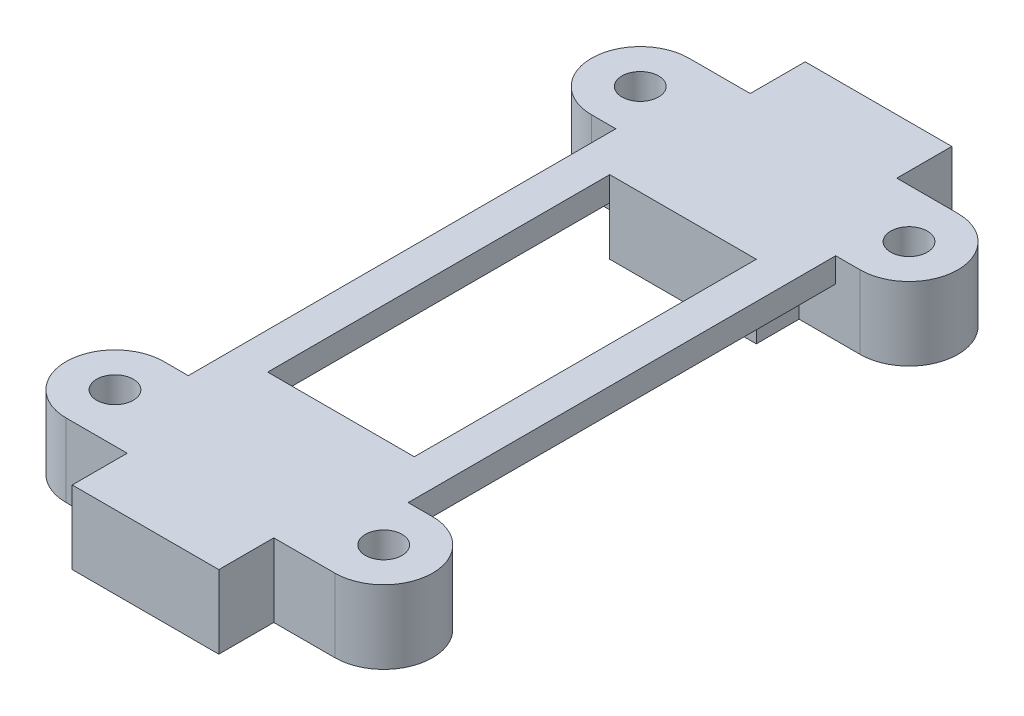
ISO-10303-21;
HEADER;
FILE_DESCRIPTION(('STEP AP214'),'2;1');
FILE_NAME('part.step','',(''),(''),'','','');
FILE_SCHEMA(('AUTOMOTIVE_DESIGN { 1 0 10303 214 1 1 1 1 }'));
ENDSEC;
DATA;
#1=APPLICATION_CONTEXT('core data for automotive mechanical design processes');
#2=APPLICATION_PROTOCOL_DEFINITION('international standard','automotive_design',2000,#1);
#3=PRODUCT_CONTEXT('',#1,'mechanical');
#4=PRODUCT('Part','Part','',(#3));
#5=PRODUCT_RELATED_PRODUCT_CATEGORY('part','',(#4));
#6=PRODUCT_DEFINITION_FORMATION('','',#4);
#7=PRODUCT_DEFINITION_CONTEXT('part definition',#1,'design');
#8=PRODUCT_DEFINITION('design','',#6,#7);
#9=PRODUCT_DEFINITION_SHAPE('','',#8);
#10=(LENGTH_UNIT() NAMED_UNIT(*) SI_UNIT(.MILLI.,.METRE.));
#11=(NAMED_UNIT(*) PLANE_ANGLE_UNIT() SI_UNIT($,.RADIAN.));
#12=(NAMED_UNIT(*) SI_UNIT($,.STERADIAN.) SOLID_ANGLE_UNIT());
#13=UNCERTAINTY_MEASURE_WITH_UNIT(LENGTH_MEASURE(1.E-05),#10,'distance_accuracy_value','');
#14=(GEOMETRIC_REPRESENTATION_CONTEXT(3) GLOBAL_UNCERTAINTY_ASSIGNED_CONTEXT((#13)) GLOBAL_UNIT_ASSIGNED_CONTEXT((#10,
#11,#12)) REPRESENTATION_CONTEXT('',''));
#15=CARTESIAN_POINT('',(0.,0.,0.));
#16=DIRECTION('',(0.,0.,1.));
#17=DIRECTION('',(1.,0.,0.));
#18=AXIS2_PLACEMENT_3D('',#15,#16,#17);
#19=CARTESIAN_POINT('',(6.,6.,4.));
#20=DIRECTION('',(1.,0.,0.));
#21=DIRECTION('',(0.,0.,-1.));
#22=AXIS2_PLACEMENT_3D('',#19,#20,#21);
#23=PLANE('',#22);
#24=DIRECTION('',(0.,-1.,0.));
#25=VECTOR('',#24,1.);
#26=CARTESIAN_POINT('',(6.,6.,4.));
#27=LINE('',#26,#25);
#28=CARTESIAN_POINT('',(6.,4.,4.));
#29=VERTEX_POINT('',#28);
#30=CARTESIAN_POINT('',(6.,0.,4.));
#31=VERTEX_POINT('',#30);
#32=EDGE_CURVE('E451',#29,#31,#27,.T.);
#33=ORIENTED_EDGE('',*,*,#32,.F.);
#34=DIRECTION('',(0.,0.,1.));
#35=VECTOR('',#34,1.);
#36=CARTESIAN_POINT('',(6.,4.,4.));
#37=LINE('',#36,#35);
#38=CARTESIAN_POINT('',(6.,4.,7.5));
#39=VERTEX_POINT('',#38);
#40=EDGE_CURVE('E369',#29,#39,#37,.T.);
#41=ORIENTED_EDGE('',*,*,#40,.T.);
#42=DIRECTION('',(0.,-1.,0.));
#43=VECTOR('',#42,1.);
#44=CARTESIAN_POINT('',(6.,6.,7.5));
#45=LINE('',#44,#43);
#46=CARTESIAN_POINT('',(6.,0.,7.5));
#47=VERTEX_POINT('',#46);
#48=EDGE_CURVE('E468',#39,#47,#45,.T.);
#49=ORIENTED_EDGE('',*,*,#48,.T.);
#50=DIRECTION('',(0.,0.,1.));
#51=VECTOR('',#50,1.);
#52=CARTESIAN_POINT('',(6.,0.,4.));
#53=LINE('',#52,#51);
#54=EDGE_CURVE('E469',#31,#47,#53,.T.);
#55=ORIENTED_EDGE('',*,*,#54,.F.);
#56=EDGE_LOOP('',(#33,#41,#49,#55));
#57=FACE_BOUND('',#56,.T.);
#58=ADVANCED_FACE('F157',(#57),#23,.T.);
#59=CARTESIAN_POINT('',(6.00000000000001,6.,39.));
#60=DIRECTION('',(-1.,0.,0.));
#61=DIRECTION('',(0.,0.,1.));
#62=AXIS2_PLACEMENT_3D('',#59,#60,#61);
#63=PLANE('',#62);
#64=CARTESIAN_POINT('',(6.00000000000001,4.,35.5));
#65=VERTEX_POINT('',#64);
#66=CARTESIAN_POINT('',(6.,4.,39.));
#67=VERTEX_POINT('',#66);
#68=EDGE_CURVE('E361',#65,#67,#37,.T.);
#69=ORIENTED_EDGE('',*,*,#68,.T.);
#70=DIRECTION('',(0.,-1.,0.));
#71=VECTOR('',#70,1.);
#72=CARTESIAN_POINT('',(6.00000000000001,6.,39.));
#73=LINE('',#72,#71);
#74=CARTESIAN_POINT('',(6.00000000000001,0.,39.));
#75=VERTEX_POINT('',#74);
#76=EDGE_CURVE('E374',#67,#75,#73,.T.);
#77=ORIENTED_EDGE('',*,*,#76,.T.);
#78=DIRECTION('',(0.,0.,-1.));
#79=VECTOR('',#78,1.);
#80=CARTESIAN_POINT('',(6.00000000000001,0.,39.));
#81=LINE('',#80,#79);
#82=CARTESIAN_POINT('',(6.00000000000001,0.,35.5));
#83=VERTEX_POINT('',#82);
#84=EDGE_CURVE('E627',#75,#83,#81,.T.);
#85=ORIENTED_EDGE('',*,*,#84,.T.);
#86=DIRECTION('',(0.,-1.,0.));
#87=VECTOR('',#86,1.);
#88=CARTESIAN_POINT('',(6.00000000000001,6.,35.5));
#89=LINE('',#88,#87);
#90=EDGE_CURVE('E376',#65,#83,#89,.T.);
#91=ORIENTED_EDGE('',*,*,#90,.F.);
#92=EDGE_LOOP('',(#69,#77,#85,#91));
#93=FACE_BOUND('',#92,.T.);
#94=ADVANCED_FACE('F372',(#93),#63,.F.);
#95=CARTESIAN_POINT('',(-6.,4.,4.));
#96=DIRECTION('',(1.,0.,0.));
#97=DIRECTION('',(0.,0.,-1.));
#98=AXIS2_PLACEMENT_3D('',#95,#96,#97);
#99=PLANE('',#98);
#100=DIRECTION('',(0.,0.,-1.));
#101=VECTOR('',#100,1.);
#102=CARTESIAN_POINT('',(-6.,6.,4.));
#103=LINE('',#102,#101);
#104=CARTESIAN_POINT('',(-6.,6.,35.5));
#105=VERTEX_POINT('',#104);
#106=CARTESIAN_POINT('',(-6.,6.,7.5));
#107=VERTEX_POINT('',#106);
#108=EDGE_CURVE('E440',#105,#107,#103,.T.);
#109=ORIENTED_EDGE('',*,*,#108,.F.);
#110=DIRECTION('',(0.,-1.,0.));
#111=VECTOR('',#110,1.);
#112=CARTESIAN_POINT('',(-5.99999999999999,6.,35.5));
#113=LINE('',#112,#111);
#114=CARTESIAN_POINT('',(-6.,4.,35.5));
#115=VERTEX_POINT('',#114);
#116=EDGE_CURVE('E397',#105,#115,#113,.T.);
#117=ORIENTED_EDGE('',*,*,#116,.T.);
#118=DIRECTION('',(0.,0.,-1.));
#119=VECTOR('',#118,1.);
#120=CARTESIAN_POINT('',(-6.,4.,4.));
#121=LINE('',#120,#119);
#122=CARTESIAN_POINT('',(-6.,4.,7.5));
#123=VERTEX_POINT('',#122);
#124=EDGE_CURVE('E427',#115,#123,#121,.T.);
#125=ORIENTED_EDGE('',*,*,#124,.T.);
#126=DIRECTION('',(0.,-1.,0.));
#127=VECTOR('',#126,1.);
#128=CARTESIAN_POINT('',(-6.,6.,7.5));
#129=LINE('',#128,#127);
#130=EDGE_CURVE('E455',#107,#123,#129,.T.);
#131=ORIENTED_EDGE('',*,*,#130,.F.);
#132=EDGE_LOOP('',(#109,#117,#125,#131));
#133=FACE_BOUND('',#132,.T.);
#134=ADVANCED_FACE('F767',(#133),#99,.T.);
#135=CARTESIAN_POINT('',(0.,6.,4.));
#136=DIRECTION('',(0.,0.,1.));
#137=DIRECTION('',(1.,0.,0.));
#138=AXIS2_PLACEMENT_3D('',#135,#136,#137);
#139=PLANE('',#138);
#140=DIRECTION('',(0.,1.,0.));
#141=VECTOR('',#140,1.);
#142=CARTESIAN_POINT('',(-9.,4.,4.));
#143=LINE('',#142,#141);
#144=CARTESIAN_POINT('',(-9.,4.,4.));
#145=VERTEX_POINT('',#144);
#146=CARTESIAN_POINT('',(-9.,6.,4.));
#147=VERTEX_POINT('',#146);
#148=EDGE_CURVE('E439',#145,#147,#143,.T.);
#149=ORIENTED_EDGE('',*,*,#148,.T.);
#150=DIRECTION('',(-1.,0.,0.));
#151=VECTOR('',#150,1.);
#152=CARTESIAN_POINT('',(0.,6.,4.));
#153=LINE('',#152,#151);
#154=CARTESIAN_POINT('',(-11.,6.,4.));
#155=VERTEX_POINT('',#154);
#156=EDGE_CURVE('E569',#147,#155,#153,.T.);
#157=ORIENTED_EDGE('',*,*,#156,.T.);
#158=DIRECTION('',(0.,-1.,0.));
#159=VECTOR('',#158,1.);
#160=CARTESIAN_POINT('',(-11.,6.,4.));
#161=LINE('',#160,#159);
#162=CARTESIAN_POINT('',(-11.,0.,4.));
#163=VERTEX_POINT('',#162);
#164=EDGE_CURVE('E482',#155,#163,#161,.T.);
#165=ORIENTED_EDGE('',*,*,#164,.T.);
#166=DIRECTION('',(-1.,0.,0.));
#167=VECTOR('',#166,1.);
#168=CARTESIAN_POINT('',(0.,0.,4.));
#169=LINE('',#168,#167);
#170=CARTESIAN_POINT('',(-6.,0.,4.));
#171=VERTEX_POINT('',#170);
#172=EDGE_CURVE('E535',#171,#163,#169,.T.);
#173=ORIENTED_EDGE('',*,*,#172,.F.);
#174=DIRECTION('',(0.,1.,0.));
#175=VECTOR('',#174,1.);
#176=CARTESIAN_POINT('',(-6.,6.,4.));
#177=LINE('',#176,#175);
#178=CARTESIAN_POINT('',(-6.,4.,4.));
#179=VERTEX_POINT('',#178);
#180=EDGE_CURVE('E463',#171,#179,#177,.T.);
#181=ORIENTED_EDGE('',*,*,#180,.T.);
#182=DIRECTION('',(-1.,0.,0.));
#183=VECTOR('',#182,1.);
#184=CARTESIAN_POINT('',(-6.,4.,4.));
#185=LINE('',#184,#183);
#186=EDGE_CURVE('E426',#179,#145,#185,.T.);
#187=ORIENTED_EDGE('',*,*,#186,.T.);
#188=EDGE_LOOP('',(#149,#157,#165,#173,#181,#187));
#189=FACE_BOUND('',#188,.T.);
#190=ADVANCED_FACE('F783',(#189),#139,.T.);
#191=DIRECTION('',(0.,1.,0.));
#192=VECTOR('',#191,1.);
#193=CARTESIAN_POINT('',(9.,4.,4.));
#194=LINE('',#193,#192);
#195=CARTESIAN_POINT('',(9.00000000000001,4.,4.));
#196=VERTEX_POINT('',#195);
#197=CARTESIAN_POINT('',(9.,6.,4.));
#198=VERTEX_POINT('',#197);
#199=EDGE_CURVE('E175',#196,#198,#194,.T.);
#200=ORIENTED_EDGE('',*,*,#199,.F.);
#201=DIRECTION('',(-1.,0.,0.));
#202=VECTOR('',#201,1.);
#203=CARTESIAN_POINT('',(6.,4.,4.));
#204=LINE('',#203,#202);
#205=EDGE_CURVE('E712',#196,#29,#204,.T.);
#206=ORIENTED_EDGE('',*,*,#205,.T.);
#207=ORIENTED_EDGE('',*,*,#32,.T.);
#208=CARTESIAN_POINT('',(11.,0.,4.));
#209=VERTEX_POINT('',#208);
#210=EDGE_CURVE('E531',#209,#31,#169,.T.);
#211=ORIENTED_EDGE('',*,*,#210,.F.);
#212=DIRECTION('',(0.,-1.,0.));
#213=VECTOR('',#212,1.);
#214=CARTESIAN_POINT('',(11.,6.,4.));
#215=LINE('',#214,#213);
#216=CARTESIAN_POINT('',(11.,6.,4.));
#217=VERTEX_POINT('',#216);
#218=EDGE_CURVE('E486',#217,#209,#215,.T.);
#219=ORIENTED_EDGE('',*,*,#218,.F.);
#220=EDGE_CURVE('E180',#217,#198,#153,.T.);
#221=ORIENTED_EDGE('',*,*,#220,.T.);
#222=EDGE_LOOP('',(#200,#206,#207,#211,#219,#221));
#223=FACE_BOUND('',#222,.T.);
#224=ADVANCED_FACE('F733',(#223),#139,.T.);
#225=CARTESIAN_POINT('',(11.,6.,0.));
#226=DIRECTION('',(0.,-1.,0.));
#227=DIRECTION('',(0.,0.,-1.));
#228=AXIS2_PLACEMENT_3D('',#225,#226,#227);
#229=CYLINDRICAL_SURFACE('',#228,4.);
#230=CARTESIAN_POINT('',(11.,0.,0.));
#231=DIRECTION('',(0.,1.,0.));
#232=DIRECTION('',(0.,0.,1.));
#233=AXIS2_PLACEMENT_3D('',#230,#231,#232);
#234=CIRCLE('',#233,4.);
#235=CARTESIAN_POINT('',(11.,0.,-4.));
#236=VERTEX_POINT('',#235);
#237=EDGE_CURVE('E527',#236,#209,#234,.F.);
#238=ORIENTED_EDGE('',*,*,#237,.F.);
#239=DIRECTION('',(0.,-1.,0.));
#240=VECTOR('',#239,1.);
#241=CARTESIAN_POINT('',(11.,6.,-4.));
#242=LINE('',#241,#240);
#243=CARTESIAN_POINT('',(11.,6.,-4.));
#244=VERTEX_POINT('',#243);
#245=EDGE_CURVE('E489',#244,#236,#242,.T.);
#246=ORIENTED_EDGE('',*,*,#245,.F.);
#247=CARTESIAN_POINT('',(11.,6.,0.));
#248=DIRECTION('',(0.,1.,0.));
#249=DIRECTION('',(0.,0.,1.));
#250=AXIS2_PLACEMENT_3D('',#247,#248,#249);
#251=CIRCLE('',#250,4.);
#252=EDGE_CURVE('E563',#244,#217,#251,.F.);
#253=ORIENTED_EDGE('',*,*,#252,.T.);
#254=ORIENTED_EDGE('',*,*,#218,.T.);
#255=EDGE_LOOP('',(#238,#246,#253,#254));
#256=FACE_BOUND('',#255,.T.);
#257=ADVANCED_FACE('F741',(#256),#229,.T.);
#258=CARTESIAN_POINT('',(0.,6.,-4.));
#259=DIRECTION('',(0.,0.,1.));
#260=DIRECTION('',(1.,0.,0.));
#261=AXIS2_PLACEMENT_3D('',#258,#259,#260);
#262=PLANE('',#261);
#263=DIRECTION('',(-1.,0.,0.));
#264=VECTOR('',#263,1.);
#265=CARTESIAN_POINT('',(0.,0.,-4.));
#266=LINE('',#265,#264);
#267=CARTESIAN_POINT('',(6.,0.,-4.));
#268=VERTEX_POINT('',#267);
#269=EDGE_CURVE('E523',#236,#268,#266,.T.);
#270=ORIENTED_EDGE('',*,*,#269,.T.);
#271=DIRECTION('',(0.,-1.,0.));
#272=VECTOR('',#271,1.);
#273=CARTESIAN_POINT('',(6.,6.,-4.));
#274=LINE('',#273,#272);
#275=CARTESIAN_POINT('',(6.,6.,-4.));
#276=VERTEX_POINT('',#275);
#277=EDGE_CURVE('E492',#276,#268,#274,.T.);
#278=ORIENTED_EDGE('',*,*,#277,.F.);
#279=DIRECTION('',(-1.,0.,0.));
#280=VECTOR('',#279,1.);
#281=CARTESIAN_POINT('',(0.,6.,-4.));
#282=LINE('',#281,#280);
#283=EDGE_CURVE('E559',#244,#276,#282,.T.);
#284=ORIENTED_EDGE('',*,*,#283,.F.);
#285=ORIENTED_EDGE('',*,*,#245,.T.);
#286=EDGE_LOOP('',(#270,#278,#284,#285));
#287=FACE_BOUND('',#286,.T.);
#288=ADVANCED_FACE('F745',(#287),#262,.F.);
#289=CARTESIAN_POINT('',(6.,6.,0.));
#290=DIRECTION('',(-1.,0.,0.));
#291=DIRECTION('',(0.,0.,1.));
#292=AXIS2_PLACEMENT_3D('',#289,#290,#291);
#293=PLANE('',#292);
#294=DIRECTION('',(0.,0.,-1.));
#295=VECTOR('',#294,1.);
#296=CARTESIAN_POINT('',(6.,0.,0.));
#297=LINE('',#296,#295);
#298=CARTESIAN_POINT('',(6.,0.,-8.5));
#299=VERTEX_POINT('',#298);
#300=EDGE_CURVE('E519',#268,#299,#297,.T.);
#301=ORIENTED_EDGE('',*,*,#300,.T.);
#302=DIRECTION('',(0.,-1.,0.));
#303=VECTOR('',#302,1.);
#304=CARTESIAN_POINT('',(6.,6.,-8.5));
#305=LINE('',#304,#303);
#306=CARTESIAN_POINT('',(6.,6.,-8.5));
#307=VERTEX_POINT('',#306);
#308=EDGE_CURVE('E496',#307,#299,#305,.T.);
#309=ORIENTED_EDGE('',*,*,#308,.F.);
#310=DIRECTION('',(0.,0.,-1.));
#311=VECTOR('',#310,1.);
#312=CARTESIAN_POINT('',(6.,6.,0.));
#313=LINE('',#312,#311);
#314=EDGE_CURVE('E555',#276,#307,#313,.T.);
#315=ORIENTED_EDGE('',*,*,#314,.F.);
#316=ORIENTED_EDGE('',*,*,#277,.T.);
#317=EDGE_LOOP('',(#301,#309,#315,#316));
#318=FACE_BOUND('',#317,.T.);
#319=ADVANCED_FACE('F749',(#318),#293,.F.);
#320=CARTESIAN_POINT('',(0.,6.,-8.5));
#321=DIRECTION('',(0.,0.,1.));
#322=DIRECTION('',(1.,0.,0.));
#323=AXIS2_PLACEMENT_3D('',#320,#321,#322);
#324=PLANE('',#323);
#325=DIRECTION('',(-1.,0.,0.));
#326=VECTOR('',#325,1.);
#327=CARTESIAN_POINT('',(0.,0.,-8.5));
#328=LINE('',#327,#326);
#329=CARTESIAN_POINT('',(-6.,0.,-8.5));
#330=VERTEX_POINT('',#329);
#331=EDGE_CURVE('E514',#299,#330,#328,.T.);
#332=ORIENTED_EDGE('',*,*,#331,.T.);
#333=DIRECTION('',(0.,-1.,0.));
#334=VECTOR('',#333,1.);
#335=CARTESIAN_POINT('',(-6.,6.,-8.5));
#336=LINE('',#335,#334);
#337=CARTESIAN_POINT('',(-6.,6.,-8.5));
#338=VERTEX_POINT('',#337);
#339=EDGE_CURVE('E500',#338,#330,#336,.T.);
#340=ORIENTED_EDGE('',*,*,#339,.F.);
#341=DIRECTION('',(-1.,0.,0.));
#342=VECTOR('',#341,1.);
#343=CARTESIAN_POINT('',(0.,6.,-8.5));
#344=LINE('',#343,#342);
#345=EDGE_CURVE('E552',#307,#338,#344,.T.);
#346=ORIENTED_EDGE('',*,*,#345,.F.);
#347=ORIENTED_EDGE('',*,*,#308,.T.);
#348=EDGE_LOOP('',(#332,#340,#346,#347));
#349=FACE_BOUND('',#348,.T.);
#350=ADVANCED_FACE('F751',(#349),#324,.F.);
#351=CARTESIAN_POINT('',(-6.,6.,0.));
#352=DIRECTION('',(-1.,0.,0.));
#353=DIRECTION('',(0.,0.,1.));
#354=AXIS2_PLACEMENT_3D('',#351,#352,#353);
#355=PLANE('',#354);
#356=DIRECTION('',(0.,0.,-1.));
#357=VECTOR('',#356,1.);
#358=CARTESIAN_POINT('',(-6.,0.,0.));
#359=LINE('',#358,#357);
#360=CARTESIAN_POINT('',(-6.,0.,-4.));
#361=VERTEX_POINT('',#360);
#362=EDGE_CURVE('E510',#361,#330,#359,.T.);
#363=ORIENTED_EDGE('',*,*,#362,.F.);
#364=DIRECTION('',(0.,-1.,0.));
#365=VECTOR('',#364,1.);
#366=CARTESIAN_POINT('',(-6.,6.,-4.));
#367=LINE('',#366,#365);
#368=CARTESIAN_POINT('',(-6.,6.,-4.));
#369=VERTEX_POINT('',#368);
#370=EDGE_CURVE('E503',#369,#361,#367,.T.);
#371=ORIENTED_EDGE('',*,*,#370,.F.);
#372=DIRECTION('',(0.,0.,-1.));
#373=VECTOR('',#372,1.);
#374=CARTESIAN_POINT('',(-6.,6.,0.));
#375=LINE('',#374,#373);
#376=EDGE_CURVE('E548',#369,#338,#375,.T.);
#377=ORIENTED_EDGE('',*,*,#376,.T.);
#378=ORIENTED_EDGE('',*,*,#339,.T.);
#379=EDGE_LOOP('',(#363,#371,#377,#378));
#380=FACE_BOUND('',#379,.T.);
#381=ADVANCED_FACE('F753',(#380),#355,.T.);
#382=CARTESIAN_POINT('',(-11.,0.,-4.));
#383=VERTEX_POINT('',#382);
#384=EDGE_CURVE('E515',#361,#383,#266,.T.);
#385=ORIENTED_EDGE('',*,*,#384,.T.);
#386=DIRECTION('',(0.,-1.,0.));
#387=VECTOR('',#386,1.);
#388=CARTESIAN_POINT('',(-11.,6.,-4.));
#389=LINE('',#388,#387);
#390=CARTESIAN_POINT('',(-11.,6.,-4.));
#391=VERTEX_POINT('',#390);
#392=EDGE_CURVE('E506',#391,#383,#389,.T.);
#393=ORIENTED_EDGE('',*,*,#392,.F.);
#394=EDGE_CURVE('E509',#369,#391,#282,.T.);
#395=ORIENTED_EDGE('',*,*,#394,.F.);
#396=ORIENTED_EDGE('',*,*,#370,.T.);
#397=EDGE_LOOP('',(#385,#393,#395,#396));
#398=FACE_BOUND('',#397,.T.);
#399=ADVANCED_FACE('F587',(#398),#262,.F.);
#400=CARTESIAN_POINT('',(-11.,6.,0.));
#401=DIRECTION('',(0.,-1.,0.));
#402=DIRECTION('',(0.,0.,-1.));
#403=AXIS2_PLACEMENT_3D('',#400,#401,#402);
#404=CYLINDRICAL_SURFACE('',#403,4.);
#405=CARTESIAN_POINT('',(-11.,0.,0.));
#406=DIRECTION('',(0.,1.,0.));
#407=DIRECTION('',(0.,0.,1.));
#408=AXIS2_PLACEMENT_3D('',#405,#406,#407);
#409=CIRCLE('',#408,4.);
#410=EDGE_CURVE('E536',#163,#383,#409,.F.);
#411=ORIENTED_EDGE('',*,*,#410,.F.);
#412=ORIENTED_EDGE('',*,*,#164,.F.);
#413=CARTESIAN_POINT('',(-11.,6.,0.));
#414=DIRECTION('',(0.,1.,0.));
#415=DIRECTION('',(0.,0.,1.));
#416=AXIS2_PLACEMENT_3D('',#413,#414,#415);
#417=CIRCLE('',#416,4.);
#418=EDGE_CURVE('E570',#155,#391,#417,.F.);
#419=ORIENTED_EDGE('',*,*,#418,.T.);
#420=ORIENTED_EDGE('',*,*,#392,.T.);
#421=EDGE_LOOP('',(#411,#412,#419,#420));
#422=FACE_BOUND('',#421,.T.);
#423=ADVANCED_FACE('F597',(#422),#404,.T.);
#424=CARTESIAN_POINT('',(11.,6.,0.));
#425=DIRECTION('',(0.,-1.,0.));
#426=DIRECTION('',(0.,0.,-1.));
#427=AXIS2_PLACEMENT_3D('',#424,#425,#426);
#428=CYLINDRICAL_SURFACE('',#427,1.5);
#429=CARTESIAN_POINT('',(11.,6.,0.));
#430=DIRECTION('',(0.,1.,0.));
#431=DIRECTION('',(0.,0.,1.));
#432=AXIS2_PLACEMENT_3D('',#429,#430,#431);
#433=CIRCLE('',#432,1.5);
#434=CARTESIAN_POINT('',(11.,6.,1.5));
#435=VERTEX_POINT('',#434);
#436=EDGE_CURVE('E573',#435,#435,#433,.T.);
#437=ORIENTED_EDGE('',*,*,#436,.T.);
#438=EDGE_LOOP('',(#437));
#439=FACE_BOUND('',#438,.T.);
#440=CARTESIAN_POINT('',(11.,0.,0.));
#441=DIRECTION('',(0.,1.,0.));
#442=DIRECTION('',(0.,0.,1.));
#443=AXIS2_PLACEMENT_3D('',#440,#441,#442);
#444=CIRCLE('',#443,1.5);
#445=CARTESIAN_POINT('',(11.,0.,1.5));
#446=VERTEX_POINT('',#445);
#447=EDGE_CURVE('E540',#446,#446,#444,.T.);
#448=ORIENTED_EDGE('',*,*,#447,.F.);
#449=EDGE_LOOP('',(#448));
#450=FACE_BOUND('',#449,.T.);
#451=ADVANCED_FACE('F776',(#439,#450),#428,.F.);
#452=CARTESIAN_POINT('',(-11.,6.,0.));
#453=DIRECTION('',(0.,-1.,0.));
#454=DIRECTION('',(0.,0.,-1.));
#455=AXIS2_PLACEMENT_3D('',#452,#453,#454);
#456=CYLINDRICAL_SURFACE('',#455,1.5);
#457=CARTESIAN_POINT('',(-11.,6.,0.));
#458=DIRECTION('',(0.,1.,0.));
#459=DIRECTION('',(0.,0.,1.));
#460=AXIS2_PLACEMENT_3D('',#457,#458,#459);
#461=CIRCLE('',#460,1.5);
#462=CARTESIAN_POINT('',(-11.,6.,1.5));
#463=VERTEX_POINT('',#462);
#464=EDGE_CURVE('E161',#463,#463,#461,.T.);
#465=ORIENTED_EDGE('',*,*,#464,.T.);
#466=EDGE_LOOP('',(#465));
#467=FACE_BOUND('',#466,.T.);
#468=CARTESIAN_POINT('',(-11.,0.,0.));
#469=DIRECTION('',(0.,1.,0.));
#470=DIRECTION('',(0.,0.,1.));
#471=AXIS2_PLACEMENT_3D('',#468,#469,#470);
#472=CIRCLE('',#471,1.5);
#473=CARTESIAN_POINT('',(-11.,0.,1.5));
#474=VERTEX_POINT('',#473);
#475=EDGE_CURVE('E544',#474,#474,#472,.T.);
#476=ORIENTED_EDGE('',*,*,#475,.F.);
#477=EDGE_LOOP('',(#476));
#478=FACE_BOUND('',#477,.T.);
#479=ADVANCED_FACE('F773',(#467,#478),#456,.F.);
#480=CARTESIAN_POINT('',(0.,0.,0.));
#481=DIRECTION('',(0.,1.,0.));
#482=DIRECTION('',(0.,0.,1.));
#483=AXIS2_PLACEMENT_3D('',#480,#481,#482);
#484=PLANE('',#483);
#485=ORIENTED_EDGE('',*,*,#475,.T.);
#486=EDGE_LOOP('',(#485));
#487=FACE_BOUND('',#486,.T.);
#488=ORIENTED_EDGE('',*,*,#447,.T.);
#489=EDGE_LOOP('',(#488));
#490=FACE_BOUND('',#489,.T.);
#491=ORIENTED_EDGE('',*,*,#410,.T.);
#492=ORIENTED_EDGE('',*,*,#384,.F.);
#493=ORIENTED_EDGE('',*,*,#362,.T.);
#494=ORIENTED_EDGE('',*,*,#331,.F.);
#495=ORIENTED_EDGE('',*,*,#300,.F.);
#496=ORIENTED_EDGE('',*,*,#269,.F.);
#497=ORIENTED_EDGE('',*,*,#237,.T.);
#498=ORIENTED_EDGE('',*,*,#210,.T.);
#499=ORIENTED_EDGE('',*,*,#54,.T.);
#500=DIRECTION('',(-1.,0.,0.));
#501=VECTOR('',#500,1.);
#502=CARTESIAN_POINT('',(6.,0.,7.5));
#503=LINE('',#502,#501);
#504=CARTESIAN_POINT('',(-6.,0.,7.5));
#505=VERTEX_POINT('',#504);
#506=EDGE_CURVE('E12',#47,#505,#503,.T.);
#507=ORIENTED_EDGE('',*,*,#506,.T.);
#508=DIRECTION('',(0.,0.,1.));
#509=VECTOR('',#508,1.);
#510=CARTESIAN_POINT('',(-6.,0.,4.));
#511=LINE('',#510,#509);
#512=EDGE_CURVE('E167',#171,#505,#511,.T.);
#513=ORIENTED_EDGE('',*,*,#512,.F.);
#514=ORIENTED_EDGE('',*,*,#172,.T.);
#515=EDGE_LOOP('',(#491,#492,#493,#494,#495,#496,#497,#498,#499,#507,#513,#514));
#516=FACE_BOUND('',#515,.T.);
#517=ADVANCED_FACE('F592',(#487,#490,#516),#484,.F.);
#518=CARTESIAN_POINT('',(0.,6.,0.));
#519=DIRECTION('',(0.,1.,0.));
#520=DIRECTION('',(0.,0.,1.));
#521=AXIS2_PLACEMENT_3D('',#518,#519,#520);
#522=PLANE('',#521);
#523=DIRECTION('',(-1.,0.,0.));
#524=VECTOR('',#523,1.);
#525=CARTESIAN_POINT('',(6.,6.,7.5));
#526=LINE('',#525,#524);
#527=CARTESIAN_POINT('',(6.,6.,7.5));
#528=VERTEX_POINT('',#527);
#529=EDGE_CURVE('E459',#528,#107,#526,.T.);
#530=ORIENTED_EDGE('',*,*,#529,.F.);
#531=DIRECTION('',(0.,0.,1.));
#532=VECTOR('',#531,1.);
#533=CARTESIAN_POINT('',(6.,6.,4.));
#534=LINE('',#533,#532);
#535=CARTESIAN_POINT('',(6.,6.,35.5));
#536=VERTEX_POINT('',#535);
#537=EDGE_CURVE('E718',#528,#536,#534,.T.);
#538=ORIENTED_EDGE('',*,*,#537,.T.);
#539=DIRECTION('',(-1.,0.,0.));
#540=VECTOR('',#539,1.);
#541=CARTESIAN_POINT('',(6.00000000000001,6.,35.5));
#542=LINE('',#541,#540);
#543=EDGE_CURVE('E670',#536,#105,#542,.T.);
#544=ORIENTED_EDGE('',*,*,#543,.T.);
#545=ORIENTED_EDGE('',*,*,#108,.T.);
#546=EDGE_LOOP('',(#530,#538,#544,#545));
#547=FACE_BOUND('',#546,.T.);
#548=DIRECTION('',(1.,0.,0.));
#549=VECTOR('',#548,1.);
#550=CARTESIAN_POINT('',(6.00000000000001,6.,39.));
#551=LINE('',#550,#549);
#552=CARTESIAN_POINT('',(9.00000000000001,6.,39.));
#553=VERTEX_POINT('',#552);
#554=CARTESIAN_POINT('',(11.,6.,39.));
#555=VERTEX_POINT('',#554);
#556=EDGE_CURVE('E667',#553,#555,#551,.T.);
#557=ORIENTED_EDGE('',*,*,#556,.F.);
#558=DIRECTION('',(0.,0.,-1.));
#559=VECTOR('',#558,1.);
#560=CARTESIAN_POINT('',(9.,6.,4.));
#561=LINE('',#560,#559);
#562=EDGE_CURVE('E380',#553,#198,#561,.T.);
#563=ORIENTED_EDGE('',*,*,#562,.T.);
#564=ORIENTED_EDGE('',*,*,#220,.F.);
#565=ORIENTED_EDGE('',*,*,#252,.F.);
#566=ORIENTED_EDGE('',*,*,#283,.T.);
#567=ORIENTED_EDGE('',*,*,#314,.T.);
#568=ORIENTED_EDGE('',*,*,#345,.T.);
#569=ORIENTED_EDGE('',*,*,#376,.F.);
#570=ORIENTED_EDGE('',*,*,#394,.T.);
#571=ORIENTED_EDGE('',*,*,#418,.F.);
#572=ORIENTED_EDGE('',*,*,#156,.F.);
#573=DIRECTION('',(0.,0.,1.));
#574=VECTOR('',#573,1.);
#575=CARTESIAN_POINT('',(-9.,6.,4.));
#576=LINE('',#575,#574);
#577=CARTESIAN_POINT('',(-9.,6.,39.));
#578=VERTEX_POINT('',#577);
#579=EDGE_CURVE('E443',#147,#578,#576,.T.);
#580=ORIENTED_EDGE('',*,*,#579,.T.);
#581=DIRECTION('',(1.,0.,0.));
#582=VECTOR('',#581,1.);
#583=CARTESIAN_POINT('',(-11.,6.,39.));
#584=LINE('',#583,#582);
#585=CARTESIAN_POINT('',(-11.,6.,39.));
#586=VERTEX_POINT('',#585);
#587=EDGE_CURVE('E674',#586,#578,#584,.T.);
#588=ORIENTED_EDGE('',*,*,#587,.F.);
#589=CARTESIAN_POINT('',(-11.,6.,43.));
#590=DIRECTION('',(0.,1.,0.));
#591=DIRECTION('',(0.,0.,1.));
#592=AXIS2_PLACEMENT_3D('',#589,#590,#591);
#593=CIRCLE('',#592,4.);
#594=CARTESIAN_POINT('',(-11.,6.,47.));
#595=VERTEX_POINT('',#594);
#596=EDGE_CURVE('E678',#586,#595,#593,.T.);
#597=ORIENTED_EDGE('',*,*,#596,.T.);
#598=DIRECTION('',(1.,0.,0.));
#599=VECTOR('',#598,1.);
#600=CARTESIAN_POINT('',(-11.,6.,47.));
#601=LINE('',#600,#599);
#602=CARTESIAN_POINT('',(-5.99999999999999,6.,47.));
#603=VERTEX_POINT('',#602);
#604=EDGE_CURVE('E681',#595,#603,#601,.T.);
#605=ORIENTED_EDGE('',*,*,#604,.T.);
#606=DIRECTION('',(0.,0.,1.));
#607=VECTOR('',#606,1.);
#608=CARTESIAN_POINT('',(-5.99999999999999,6.,47.));
#609=LINE('',#608,#607);
#610=CARTESIAN_POINT('',(-5.99999999999999,6.,51.5));
#611=VERTEX_POINT('',#610);
#612=EDGE_CURVE('E684',#603,#611,#609,.T.);
#613=ORIENTED_EDGE('',*,*,#612,.T.);
#614=DIRECTION('',(-1.,0.,0.));
#615=VECTOR('',#614,1.);
#616=CARTESIAN_POINT('',(6.00000000000001,6.,51.5));
#617=LINE('',#616,#615);
#618=CARTESIAN_POINT('',(6.00000000000001,6.,51.5));
#619=VERTEX_POINT('',#618);
#620=EDGE_CURVE('E687',#619,#611,#617,.T.);
#621=ORIENTED_EDGE('',*,*,#620,.F.);
#622=DIRECTION('',(0.,0.,1.));
#623=VECTOR('',#622,1.);
#624=CARTESIAN_POINT('',(6.00000000000002,6.,47.));
#625=LINE('',#624,#623);
#626=CARTESIAN_POINT('',(6.00000000000002,6.,47.));
#627=VERTEX_POINT('',#626);
#628=EDGE_CURVE('E621',#627,#619,#625,.T.);
#629=ORIENTED_EDGE('',*,*,#628,.F.);
#630=DIRECTION('',(1.,0.,0.));
#631=VECTOR('',#630,1.);
#632=CARTESIAN_POINT('',(6.00000000000002,6.,47.));
#633=LINE('',#632,#631);
#634=CARTESIAN_POINT('',(11.,6.,47.));
#635=VERTEX_POINT('',#634);
#636=EDGE_CURVE('E421',#627,#635,#633,.T.);
#637=ORIENTED_EDGE('',*,*,#636,.T.);
#638=CARTESIAN_POINT('',(11.,6.,43.));
#639=DIRECTION('',(0.,1.,0.));
#640=DIRECTION('',(0.,0.,1.));
#641=AXIS2_PLACEMENT_3D('',#638,#639,#640);
#642=CIRCLE('',#641,4.);
#643=EDGE_CURVE('E663',#635,#555,#642,.T.);
#644=ORIENTED_EDGE('',*,*,#643,.T.);
#645=EDGE_LOOP('',(#557,#563,#564,#565,#566,#567,#568,#569,#570,#571,#572,#580,#588,#597,#605,
#613,#621,#629,#637,#644));
#646=FACE_BOUND('',#645,.T.);
#647=ORIENTED_EDGE('',*,*,#464,.F.);
#648=EDGE_LOOP('',(#647));
#649=FACE_BOUND('',#648,.T.);
#650=ORIENTED_EDGE('',*,*,#436,.F.);
#651=EDGE_LOOP('',(#650));
#652=FACE_BOUND('',#651,.T.);
#653=CARTESIAN_POINT('',(11.,6.,43.));
#654=DIRECTION('',(0.,-1.,0.));
#655=DIRECTION('',(0.,0.,-1.));
#656=AXIS2_PLACEMENT_3D('',#653,#654,#655);
#657=CIRCLE('',#656,1.5);
#658=CARTESIAN_POINT('',(11.,6.,41.5));
#659=VERTEX_POINT('',#658);
#660=EDGE_CURVE('E698',#659,#659,#657,.T.);
#661=ORIENTED_EDGE('',*,*,#660,.T.);
#662=EDGE_LOOP('',(#661));
#663=FACE_BOUND('',#662,.T.);
#664=CARTESIAN_POINT('',(-11.,6.,43.));
#665=DIRECTION('',(0.,-1.,0.));
#666=DIRECTION('',(0.,0.,-1.));
#667=AXIS2_PLACEMENT_3D('',#664,#665,#666);
#668=CIRCLE('',#667,1.5);
#669=CARTESIAN_POINT('',(-11.,6.,41.5));
#670=VERTEX_POINT('',#669);
#671=EDGE_CURVE('E660',#670,#670,#668,.T.);
#672=ORIENTED_EDGE('',*,*,#671,.T.);
#673=EDGE_LOOP('',(#672));
#674=FACE_BOUND('',#673,.T.);
#675=ADVANCED_FACE('F159',(#547,#646,#649,#652,#663,#674),#522,.T.);
#676=CARTESIAN_POINT('',(-6.,6.,4.));
#677=DIRECTION('',(1.,0.,0.));
#678=DIRECTION('',(0.,0.,-1.));
#679=AXIS2_PLACEMENT_3D('',#676,#677,#678);
#680=PLANE('',#679);
#681=EDGE_CURVE('E460',#123,#505,#129,.T.);
#682=ORIENTED_EDGE('',*,*,#681,.F.);
#683=EDGE_CURVE('E428',#123,#179,#121,.T.);
#684=ORIENTED_EDGE('',*,*,#683,.T.);
#685=ORIENTED_EDGE('',*,*,#180,.F.);
#686=ORIENTED_EDGE('',*,*,#512,.T.);
#687=EDGE_LOOP('',(#682,#684,#685,#686));
#688=FACE_BOUND('',#687,.T.);
#689=ADVANCED_FACE('F771',(#688),#680,.F.);
#690=CARTESIAN_POINT('',(6.,6.,7.5));
#691=DIRECTION('',(0.,0.,1.));
#692=DIRECTION('',(1.,0.,0.));
#693=AXIS2_PLACEMENT_3D('',#690,#691,#692);
#694=PLANE('',#693);
#695=ORIENTED_EDGE('',*,*,#506,.F.);
#696=ORIENTED_EDGE('',*,*,#48,.F.);
#697=EDGE_CURVE('E464',#528,#39,#45,.T.);
#698=ORIENTED_EDGE('',*,*,#697,.F.);
#699=ORIENTED_EDGE('',*,*,#529,.T.);
#700=ORIENTED_EDGE('',*,*,#130,.T.);
#701=ORIENTED_EDGE('',*,*,#681,.T.);
#702=EDGE_LOOP('',(#695,#696,#698,#699,#700,#701));
#703=FACE_BOUND('',#702,.T.);
#704=ADVANCED_FACE('F798',(#703),#694,.T.);
#705=CARTESIAN_POINT('',(-9.,4.,4.));
#706=DIRECTION('',(-1.,0.,0.));
#707=DIRECTION('',(0.,0.,1.));
#708=AXIS2_PLACEMENT_3D('',#705,#706,#707);
#709=PLANE('',#708);
#710=ORIENTED_EDGE('',*,*,#579,.F.);
#711=ORIENTED_EDGE('',*,*,#148,.F.);
#712=DIRECTION('',(0.,0.,1.));
#713=VECTOR('',#712,1.);
#714=CARTESIAN_POINT('',(-9.,4.,4.));
#715=LINE('',#714,#713);
#716=CARTESIAN_POINT('',(-9.,4.,39.));
#717=VERTEX_POINT('',#716);
#718=EDGE_CURVE('E432',#145,#717,#715,.T.);
#719=ORIENTED_EDGE('',*,*,#718,.T.);
#720=DIRECTION('',(0.,1.,0.));
#721=VECTOR('',#720,1.);
#722=CARTESIAN_POINT('',(-9.,4.,39.));
#723=LINE('',#722,#721);
#724=EDGE_CURVE('E448',#717,#578,#723,.T.);
#725=ORIENTED_EDGE('',*,*,#724,.T.);
#726=EDGE_LOOP('',(#710,#711,#719,#725));
#727=FACE_BOUND('',#726,.T.);
#728=ADVANCED_FACE('F808',(#727),#709,.T.);
#729=CARTESIAN_POINT('',(0.,4.,0.));
#730=DIRECTION('',(0.,-1.,0.));
#731=DIRECTION('',(0.,0.,-1.));
#732=AXIS2_PLACEMENT_3D('',#729,#730,#731);
#733=PLANE('',#732);
#734=CARTESIAN_POINT('',(-5.99999999999999,4.,39.));
#735=VERTEX_POINT('',#734);
#736=EDGE_CURVE('E422',#735,#115,#121,.T.);
#737=ORIENTED_EDGE('',*,*,#736,.F.);
#738=DIRECTION('',(1.,0.,0.));
#739=VECTOR('',#738,1.);
#740=CARTESIAN_POINT('',(-6.,4.,39.));
#741=LINE('',#740,#739);
#742=EDGE_CURVE('E435',#717,#735,#741,.T.);
#743=ORIENTED_EDGE('',*,*,#742,.F.);
#744=ORIENTED_EDGE('',*,*,#718,.F.);
#745=ORIENTED_EDGE('',*,*,#186,.F.);
#746=ORIENTED_EDGE('',*,*,#683,.F.);
#747=ORIENTED_EDGE('',*,*,#124,.F.);
#748=EDGE_LOOP('',(#737,#743,#744,#745,#746,#747));
#749=FACE_BOUND('',#748,.T.);
#750=ADVANCED_FACE('F815',(#749),#733,.T.);
#751=CARTESIAN_POINT('',(6.00000000000002,6.,47.));
#752=DIRECTION('',(1.,0.,0.));
#753=DIRECTION('',(0.,0.,-1.));
#754=AXIS2_PLACEMENT_3D('',#751,#752,#753);
#755=PLANE('',#754);
#756=DIRECTION('',(0.,0.,1.));
#757=VECTOR('',#756,1.);
#758=CARTESIAN_POINT('',(6.00000000000002,0.,47.));
#759=LINE('',#758,#757);
#760=CARTESIAN_POINT('',(6.00000000000002,0.,47.));
#761=VERTEX_POINT('',#760);
#762=CARTESIAN_POINT('',(6.00000000000001,0.,51.5));
#763=VERTEX_POINT('',#762);
#764=EDGE_CURVE('E656',#761,#763,#759,.T.);
#765=ORIENTED_EDGE('',*,*,#764,.F.);
#766=DIRECTION('',(0.,-1.,0.));
#767=VECTOR('',#766,1.);
#768=CARTESIAN_POINT('',(6.00000000000002,6.,47.));
#769=LINE('',#768,#767);
#770=EDGE_CURVE('E444',#627,#761,#769,.T.);
#771=ORIENTED_EDGE('',*,*,#770,.F.);
#772=ORIENTED_EDGE('',*,*,#628,.T.);
#773=DIRECTION('',(0.,-1.,0.));
#774=VECTOR('',#773,1.);
#775=CARTESIAN_POINT('',(6.00000000000001,6.,51.5));
#776=LINE('',#775,#774);
#777=EDGE_CURVE('E418',#619,#763,#776,.T.);
#778=ORIENTED_EDGE('',*,*,#777,.T.);
#779=EDGE_LOOP('',(#765,#771,#772,#778));
#780=FACE_BOUND('',#779,.T.);
#781=ADVANCED_FACE('F824',(#780),#755,.T.);
#782=CARTESIAN_POINT('',(6.00000000000002,6.,47.));
#783=DIRECTION('',(0.,0.,-1.));
#784=DIRECTION('',(-1.,0.,0.));
#785=AXIS2_PLACEMENT_3D('',#782,#783,#784);
#786=PLANE('',#785);
#787=DIRECTION('',(1.,0.,0.));
#788=VECTOR('',#787,1.);
#789=CARTESIAN_POINT('',(6.00000000000002,0.,47.));
#790=LINE('',#789,#788);
#791=CARTESIAN_POINT('',(11.,0.,47.));
#792=VERTEX_POINT('',#791);
#793=EDGE_CURVE('E618',#761,#792,#790,.T.);
#794=ORIENTED_EDGE('',*,*,#793,.T.);
#795=DIRECTION('',(0.,-1.,0.));
#796=VECTOR('',#795,1.);
#797=CARTESIAN_POINT('',(11.,6.,47.));
#798=LINE('',#797,#796);
#799=EDGE_CURVE('E392',#635,#792,#798,.T.);
#800=ORIENTED_EDGE('',*,*,#799,.F.);
#801=ORIENTED_EDGE('',*,*,#636,.F.);
#802=ORIENTED_EDGE('',*,*,#770,.T.);
#803=EDGE_LOOP('',(#794,#800,#801,#802));
#804=FACE_BOUND('',#803,.T.);
#805=ADVANCED_FACE('F828',(#804),#786,.F.);
#806=CARTESIAN_POINT('',(11.,6.,43.));
#807=DIRECTION('',(0.,-1.,0.));
#808=DIRECTION('',(0.,0.,-1.));
#809=AXIS2_PLACEMENT_3D('',#806,#807,#808);
#810=CYLINDRICAL_SURFACE('',#809,4.);
#811=CARTESIAN_POINT('',(11.,0.,43.));
#812=DIRECTION('',(0.,1.,0.));
#813=DIRECTION('',(0.,0.,1.));
#814=AXIS2_PLACEMENT_3D('',#811,#812,#813);
#815=CIRCLE('',#814,4.);
#816=CARTESIAN_POINT('',(11.,0.,39.));
#817=VERTEX_POINT('',#816);
#818=EDGE_CURVE('E622',#792,#817,#815,.T.);
#819=ORIENTED_EDGE('',*,*,#818,.T.);
#820=DIRECTION('',(0.,-1.,0.));
#821=VECTOR('',#820,1.);
#822=CARTESIAN_POINT('',(11.,6.,39.));
#823=LINE('',#822,#821);
#824=EDGE_CURVE('E387',#555,#817,#823,.T.);
#825=ORIENTED_EDGE('',*,*,#824,.F.);
#826=ORIENTED_EDGE('',*,*,#643,.F.);
#827=ORIENTED_EDGE('',*,*,#799,.T.);
#828=EDGE_LOOP('',(#819,#825,#826,#827));
#829=FACE_BOUND('',#828,.T.);
#830=ADVANCED_FACE('F861',(#829),#810,.T.);
#831=CARTESIAN_POINT('',(6.00000000000001,6.,39.));
#832=DIRECTION('',(0.,0.,-1.));
#833=DIRECTION('',(-1.,0.,0.));
#834=AXIS2_PLACEMENT_3D('',#831,#832,#833);
#835=PLANE('',#834);
#836=DIRECTION('',(0.,1.,0.));
#837=VECTOR('',#836,1.);
#838=CARTESIAN_POINT('',(9.00000000000001,4.,39.));
#839=LINE('',#838,#837);
#840=CARTESIAN_POINT('',(9.00000000000001,4.,39.));
#841=VERTEX_POINT('',#840);
#842=EDGE_CURVE('E709',#841,#553,#839,.T.);
#843=ORIENTED_EDGE('',*,*,#842,.T.);
#844=ORIENTED_EDGE('',*,*,#556,.T.);
#845=ORIENTED_EDGE('',*,*,#824,.T.);
#846=DIRECTION('',(1.,0.,0.));
#847=VECTOR('',#846,1.);
#848=CARTESIAN_POINT('',(6.00000000000001,0.,39.));
#849=LINE('',#848,#847);
#850=EDGE_CURVE('E385',#75,#817,#849,.T.);
#851=ORIENTED_EDGE('',*,*,#850,.F.);
#852=ORIENTED_EDGE('',*,*,#76,.F.);
#853=DIRECTION('',(1.,0.,0.));
#854=VECTOR('',#853,1.);
#855=CARTESIAN_POINT('',(6.,4.,39.));
#856=LINE('',#855,#854);
#857=EDGE_CURVE('E356',#67,#841,#856,.T.);
#858=ORIENTED_EDGE('',*,*,#857,.T.);
#859=EDGE_LOOP('',(#843,#844,#845,#851,#852,#858));
#860=FACE_BOUND('',#859,.T.);
#861=ADVANCED_FACE('F383',(#860),#835,.T.);
#862=CARTESIAN_POINT('',(6.00000000000001,6.,35.5));
#863=DIRECTION('',(0.,0.,1.));
#864=DIRECTION('',(1.,0.,0.));
#865=AXIS2_PLACEMENT_3D('',#862,#863,#864);
#866=PLANE('',#865);
#867=DIRECTION('',(-1.,0.,0.));
#868=VECTOR('',#867,1.);
#869=CARTESIAN_POINT('',(6.00000000000001,0.,35.5));
#870=LINE('',#869,#868);
#871=CARTESIAN_POINT('',(-5.99999999999999,0.,35.5));
#872=VERTEX_POINT('',#871);
#873=EDGE_CURVE('E630',#83,#872,#870,.T.);
#874=ORIENTED_EDGE('',*,*,#873,.T.);
#875=EDGE_CURVE('E400',#115,#872,#113,.T.);
#876=ORIENTED_EDGE('',*,*,#875,.F.);
#877=ORIENTED_EDGE('',*,*,#116,.F.);
#878=ORIENTED_EDGE('',*,*,#543,.F.);
#879=EDGE_CURVE('E388',#536,#65,#89,.T.);
#880=ORIENTED_EDGE('',*,*,#879,.T.);
#881=ORIENTED_EDGE('',*,*,#90,.T.);
#882=EDGE_LOOP('',(#874,#876,#877,#878,#880,#881));
#883=FACE_BOUND('',#882,.T.);
#884=ADVANCED_FACE('F854',(#883),#866,.F.);
#885=CARTESIAN_POINT('',(-5.99999999999999,6.,39.));
#886=DIRECTION('',(-1.,0.,0.));
#887=DIRECTION('',(0.,0.,1.));
#888=AXIS2_PLACEMENT_3D('',#885,#886,#887);
#889=PLANE('',#888);
#890=DIRECTION('',(0.,-1.,0.));
#891=VECTOR('',#890,1.);
#892=CARTESIAN_POINT('',(-5.99999999999999,6.,39.));
#893=LINE('',#892,#891);
#894=CARTESIAN_POINT('',(-5.99999999999999,0.,39.));
#895=VERTEX_POINT('',#894);
#896=EDGE_CURVE('E401',#735,#895,#893,.T.);
#897=ORIENTED_EDGE('',*,*,#896,.F.);
#898=ORIENTED_EDGE('',*,*,#736,.T.);
#899=ORIENTED_EDGE('',*,*,#875,.T.);
#900=DIRECTION('',(0.,0.,-1.));
#901=VECTOR('',#900,1.);
#902=CARTESIAN_POINT('',(-5.99999999999999,0.,39.));
#903=LINE('',#902,#901);
#904=EDGE_CURVE('E634',#895,#872,#903,.T.);
#905=ORIENTED_EDGE('',*,*,#904,.F.);
#906=EDGE_LOOP('',(#897,#898,#899,#905));
#907=FACE_BOUND('',#906,.T.);
#908=ADVANCED_FACE('F850',(#907),#889,.T.);
#909=CARTESIAN_POINT('',(-11.,6.,39.));
#910=DIRECTION('',(0.,0.,-1.));
#911=DIRECTION('',(-1.,0.,0.));
#912=AXIS2_PLACEMENT_3D('',#909,#910,#911);
#913=PLANE('',#912);
#914=ORIENTED_EDGE('',*,*,#587,.T.);
#915=ORIENTED_EDGE('',*,*,#724,.F.);
#916=ORIENTED_EDGE('',*,*,#742,.T.);
#917=ORIENTED_EDGE('',*,*,#896,.T.);
#918=DIRECTION('',(1.,0.,0.));
#919=VECTOR('',#918,1.);
#920=CARTESIAN_POINT('',(-11.,0.,39.));
#921=LINE('',#920,#919);
#922=CARTESIAN_POINT('',(-11.,0.,39.));
#923=VERTEX_POINT('',#922);
#924=EDGE_CURVE('E638',#923,#895,#921,.T.);
#925=ORIENTED_EDGE('',*,*,#924,.F.);
#926=DIRECTION('',(0.,-1.,0.));
#927=VECTOR('',#926,1.);
#928=CARTESIAN_POINT('',(-11.,6.,39.));
#929=LINE('',#928,#927);
#930=EDGE_CURVE('E404',#586,#923,#929,.T.);
#931=ORIENTED_EDGE('',*,*,#930,.F.);
#932=EDGE_LOOP('',(#914,#915,#916,#917,#925,#931));
#933=FACE_BOUND('',#932,.T.);
#934=ADVANCED_FACE('F846',(#933),#913,.T.);
#935=CARTESIAN_POINT('',(-11.,6.,43.));
#936=DIRECTION('',(0.,-1.,0.));
#937=DIRECTION('',(0.,0.,-1.));
#938=AXIS2_PLACEMENT_3D('',#935,#936,#937);
#939=CYLINDRICAL_SURFACE('',#938,4.);
#940=CARTESIAN_POINT('',(-11.,0.,43.));
#941=DIRECTION('',(0.,1.,0.));
#942=DIRECTION('',(0.,0.,1.));
#943=AXIS2_PLACEMENT_3D('',#940,#941,#942);
#944=CIRCLE('',#943,4.);
#945=CARTESIAN_POINT('',(-11.,0.,47.));
#946=VERTEX_POINT('',#945);
#947=EDGE_CURVE('E642',#923,#946,#944,.T.);
#948=ORIENTED_EDGE('',*,*,#947,.T.);
#949=DIRECTION('',(0.,-1.,0.));
#950=VECTOR('',#949,1.);
#951=CARTESIAN_POINT('',(-11.,6.,47.));
#952=LINE('',#951,#950);
#953=EDGE_CURVE('E407',#595,#946,#952,.T.);
#954=ORIENTED_EDGE('',*,*,#953,.F.);
#955=ORIENTED_EDGE('',*,*,#596,.F.);
#956=ORIENTED_EDGE('',*,*,#930,.T.);
#957=EDGE_LOOP('',(#948,#954,#955,#956));
#958=FACE_BOUND('',#957,.T.);
#959=ADVANCED_FACE('F842',(#958),#939,.T.);
#960=CARTESIAN_POINT('',(-11.,6.,47.));
#961=DIRECTION('',(0.,0.,-1.));
#962=DIRECTION('',(-1.,0.,0.));
#963=AXIS2_PLACEMENT_3D('',#960,#961,#962);
#964=PLANE('',#963);
#965=DIRECTION('',(1.,0.,0.));
#966=VECTOR('',#965,1.);
#967=CARTESIAN_POINT('',(-11.,0.,47.));
#968=LINE('',#967,#966);
#969=CARTESIAN_POINT('',(-5.99999999999999,0.,47.));
#970=VERTEX_POINT('',#969);
#971=EDGE_CURVE('E645',#946,#970,#968,.T.);
#972=ORIENTED_EDGE('',*,*,#971,.T.);
#973=DIRECTION('',(0.,-1.,0.));
#974=VECTOR('',#973,1.);
#975=CARTESIAN_POINT('',(-5.99999999999999,6.,47.));
#976=LINE('',#975,#974);
#977=EDGE_CURVE('E411',#603,#970,#976,.T.);
#978=ORIENTED_EDGE('',*,*,#977,.F.);
#979=ORIENTED_EDGE('',*,*,#604,.F.);
#980=ORIENTED_EDGE('',*,*,#953,.T.);
#981=EDGE_LOOP('',(#972,#978,#979,#980));
#982=FACE_BOUND('',#981,.T.);
#983=ADVANCED_FACE('F838',(#982),#964,.F.);
#984=CARTESIAN_POINT('',(-5.99999999999999,6.,47.));
#985=DIRECTION('',(1.,0.,0.));
#986=DIRECTION('',(0.,0.,-1.));
#987=AXIS2_PLACEMENT_3D('',#984,#985,#986);
#988=PLANE('',#987);
#989=DIRECTION('',(0.,0.,1.));
#990=VECTOR('',#989,1.);
#991=CARTESIAN_POINT('',(-5.99999999999999,0.,47.));
#992=LINE('',#991,#990);
#993=CARTESIAN_POINT('',(-5.99999999999999,0.,51.5));
#994=VERTEX_POINT('',#993);
#995=EDGE_CURVE('E648',#970,#994,#992,.T.);
#996=ORIENTED_EDGE('',*,*,#995,.T.);
#997=DIRECTION('',(0.,-1.,0.));
#998=VECTOR('',#997,1.);
#999=CARTESIAN_POINT('',(-5.99999999999999,6.,51.5));
#1000=LINE('',#999,#998);
#1001=EDGE_CURVE('E415',#611,#994,#1000,.T.);
#1002=ORIENTED_EDGE('',*,*,#1001,.F.);
#1003=ORIENTED_EDGE('',*,*,#612,.F.);
#1004=ORIENTED_EDGE('',*,*,#977,.T.);
#1005=EDGE_LOOP('',(#996,#1002,#1003,#1004));
#1006=FACE_BOUND('',#1005,.T.);
#1007=ADVANCED_FACE('F834',(#1006),#988,.F.);
#1008=CARTESIAN_POINT('',(6.00000000000001,6.,51.5));
#1009=DIRECTION('',(0.,0.,1.));
#1010=DIRECTION('',(1.,0.,0.));
#1011=AXIS2_PLACEMENT_3D('',#1008,#1009,#1010);
#1012=PLANE('',#1011);
#1013=DIRECTION('',(-1.,0.,0.));
#1014=VECTOR('',#1013,1.);
#1015=CARTESIAN_POINT('',(6.00000000000001,0.,51.5));
#1016=LINE('',#1015,#1014);
#1017=EDGE_CURVE('E652',#763,#994,#1016,.T.);
#1018=ORIENTED_EDGE('',*,*,#1017,.F.);
#1019=ORIENTED_EDGE('',*,*,#777,.F.);
#1020=ORIENTED_EDGE('',*,*,#620,.T.);
#1021=ORIENTED_EDGE('',*,*,#1001,.T.);
#1022=EDGE_LOOP('',(#1018,#1019,#1020,#1021));
#1023=FACE_BOUND('',#1022,.T.);
#1024=ADVANCED_FACE('F830',(#1023),#1012,.T.);
#1025=CARTESIAN_POINT('',(-11.,0.,43.));
#1026=DIRECTION('',(0.,1.,0.));
#1027=DIRECTION('',(0.,0.,1.));
#1028=AXIS2_PLACEMENT_3D('',#1025,#1026,#1027);
#1029=PLANE('',#1028);
#1030=CARTESIAN_POINT('',(11.,0.,43.));
#1031=DIRECTION('',(0.,-1.,0.));
#1032=DIRECTION('',(0.,0.,-1.));
#1033=AXIS2_PLACEMENT_3D('',#1030,#1031,#1032);
#1034=CIRCLE('',#1033,1.5);
#1035=CARTESIAN_POINT('',(11.,0.,41.5));
#1036=VERTEX_POINT('',#1035);
#1037=EDGE_CURVE('E702',#1036,#1036,#1034,.T.);
#1038=ORIENTED_EDGE('',*,*,#1037,.F.);
#1039=EDGE_LOOP('',(#1038));
#1040=FACE_BOUND('',#1039,.T.);
#1041=CARTESIAN_POINT('',(-11.,0.,43.));
#1042=DIRECTION('',(0.,-1.,0.));
#1043=DIRECTION('',(0.,0.,-1.));
#1044=AXIS2_PLACEMENT_3D('',#1041,#1042,#1043);
#1045=CIRCLE('',#1044,1.5);
#1046=CARTESIAN_POINT('',(-11.,0.,41.5));
#1047=VERTEX_POINT('',#1046);
#1048=EDGE_CURVE('E694',#1047,#1047,#1045,.T.);
#1049=ORIENTED_EDGE('',*,*,#1048,.F.);
#1050=EDGE_LOOP('',(#1049));
#1051=FACE_BOUND('',#1050,.T.);
#1052=ORIENTED_EDGE('',*,*,#764,.T.);
#1053=ORIENTED_EDGE('',*,*,#1017,.T.);
#1054=ORIENTED_EDGE('',*,*,#995,.F.);
#1055=ORIENTED_EDGE('',*,*,#971,.F.);
#1056=ORIENTED_EDGE('',*,*,#947,.F.);
#1057=ORIENTED_EDGE('',*,*,#924,.T.);
#1058=ORIENTED_EDGE('',*,*,#904,.T.);
#1059=ORIENTED_EDGE('',*,*,#873,.F.);
#1060=ORIENTED_EDGE('',*,*,#84,.F.);
#1061=ORIENTED_EDGE('',*,*,#850,.T.);
#1062=ORIENTED_EDGE('',*,*,#818,.F.);
#1063=ORIENTED_EDGE('',*,*,#793,.F.);
#1064=EDGE_LOOP('',(#1052,#1053,#1054,#1055,#1056,#1057,#1058,#1059,#1060,#1061,#1062,#1063));
#1065=FACE_BOUND('',#1064,.T.);
#1066=ADVANCED_FACE('F833',(#1040,#1051,#1065),#1029,.F.);
#1067=CARTESIAN_POINT('',(-11.,6.,43.));
#1068=DIRECTION('',(0.,-1.,0.));
#1069=DIRECTION('',(0.,0.,-1.));
#1070=AXIS2_PLACEMENT_3D('',#1067,#1068,#1069);
#1071=CYLINDRICAL_SURFACE('',#1070,1.5);
#1072=ORIENTED_EDGE('',*,*,#671,.F.);
#1073=EDGE_LOOP('',(#1072));
#1074=FACE_BOUND('',#1073,.T.);
#1075=ORIENTED_EDGE('',*,*,#1048,.T.);
#1076=EDGE_LOOP('',(#1075));
#1077=FACE_BOUND('',#1076,.T.);
#1078=ADVANCED_FACE('F869',(#1074,#1077),#1071,.F.);
#1079=CARTESIAN_POINT('',(11.,6.,43.));
#1080=DIRECTION('',(0.,-1.,0.));
#1081=DIRECTION('',(0.,0.,-1.));
#1082=AXIS2_PLACEMENT_3D('',#1079,#1080,#1081);
#1083=CYLINDRICAL_SURFACE('',#1082,1.5);
#1084=ORIENTED_EDGE('',*,*,#660,.F.);
#1085=EDGE_LOOP('',(#1084));
#1086=FACE_BOUND('',#1085,.T.);
#1087=ORIENTED_EDGE('',*,*,#1037,.T.);
#1088=EDGE_LOOP('',(#1087));
#1089=FACE_BOUND('',#1088,.T.);
#1090=ADVANCED_FACE('F873',(#1086,#1089),#1083,.F.);
#1091=CARTESIAN_POINT('',(6.,4.,4.));
#1092=DIRECTION('',(-1.,0.,0.));
#1093=DIRECTION('',(0.,0.,1.));
#1094=AXIS2_PLACEMENT_3D('',#1091,#1092,#1093);
#1095=PLANE('',#1094);
#1096=ORIENTED_EDGE('',*,*,#537,.F.);
#1097=ORIENTED_EDGE('',*,*,#697,.T.);
#1098=EDGE_CURVE('E379',#39,#65,#37,.T.);
#1099=ORIENTED_EDGE('',*,*,#1098,.T.);
#1100=ORIENTED_EDGE('',*,*,#879,.F.);
#1101=EDGE_LOOP('',(#1096,#1097,#1099,#1100));
#1102=FACE_BOUND('',#1101,.T.);
#1103=ADVANCED_FACE('F732',(#1102),#1095,.T.);
#1104=CARTESIAN_POINT('',(9.,4.,4.));
#1105=DIRECTION('',(1.,0.,0.));
#1106=DIRECTION('',(0.,0.,-1.));
#1107=AXIS2_PLACEMENT_3D('',#1104,#1105,#1106);
#1108=PLANE('',#1107);
#1109=ORIENTED_EDGE('',*,*,#562,.F.);
#1110=ORIENTED_EDGE('',*,*,#842,.F.);
#1111=DIRECTION('',(0.,0.,-1.));
#1112=VECTOR('',#1111,1.);
#1113=CARTESIAN_POINT('',(9.,4.,4.));
#1114=LINE('',#1113,#1112);
#1115=EDGE_CURVE('E364',#841,#196,#1114,.T.);
#1116=ORIENTED_EDGE('',*,*,#1115,.T.);
#1117=ORIENTED_EDGE('',*,*,#199,.T.);
#1118=EDGE_LOOP('',(#1109,#1110,#1116,#1117));
#1119=FACE_BOUND('',#1118,.T.);
#1120=ADVANCED_FACE('F880',(#1119),#1108,.T.);
#1121=CARTESIAN_POINT('',(0.,4.,0.));
#1122=DIRECTION('',(0.,1.,0.));
#1123=DIRECTION('',(0.,0.,1.));
#1124=AXIS2_PLACEMENT_3D('',#1121,#1122,#1123);
#1125=PLANE('',#1124);
#1126=ORIENTED_EDGE('',*,*,#40,.F.);
#1127=ORIENTED_EDGE('',*,*,#205,.F.);
#1128=ORIENTED_EDGE('',*,*,#1115,.F.);
#1129=ORIENTED_EDGE('',*,*,#857,.F.);
#1130=ORIENTED_EDGE('',*,*,#68,.F.);
#1131=ORIENTED_EDGE('',*,*,#1098,.F.);
#1132=EDGE_LOOP('',(#1126,#1127,#1128,#1129,#1130,#1131));
#1133=FACE_BOUND('',#1132,.T.);
#1134=ADVANCED_FACE('F359',(#1133),#1125,.F.);
#1135=CLOSED_SHELL('',(#58,#94,#134,#190,#224,#257,#288,#319,#350,#381,#399,#423,#451,#479,#517,
#675,#689,#704,#728,#750,#781,#805,#830,#861,#884,#908,#934,#959,#983,#1007,#1024,#1066,#1078,
#1090,#1103,#1120,#1134));
#1136=MANIFOLD_SOLID_BREP('B2',#1135);
#1137=ADVANCED_BREP_SHAPE_REPRESENTATION('',(#18,#1136),#14);
#1138=SHAPE_DEFINITION_REPRESENTATION(#9,#1137);
ENDSEC;
END-ISO-10303-21;
